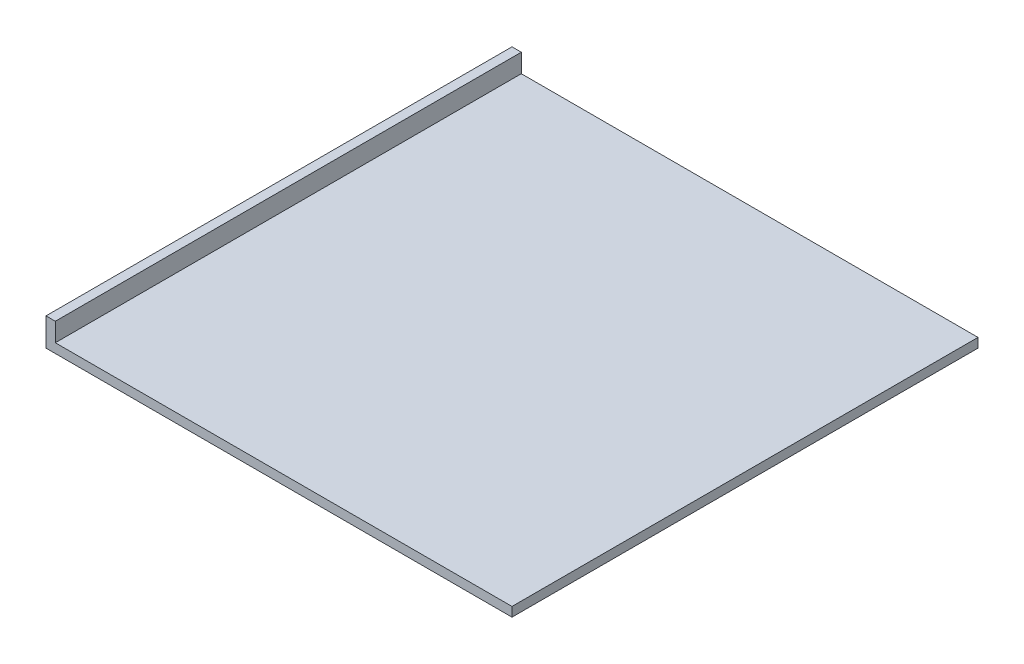
ISO-10303-21;
HEADER;
FILE_DESCRIPTION(('STEP AP214'),'2;1');
FILE_NAME('part.step','',(''),(''),'','','');
FILE_SCHEMA(('AUTOMOTIVE_DESIGN { 1 0 10303 214 1 1 1 1 }'));
ENDSEC;
DATA;
#1=APPLICATION_CONTEXT('core data for automotive mechanical design processes');
#2=APPLICATION_PROTOCOL_DEFINITION('international standard','automotive_design',2000,#1);
#3=PRODUCT_CONTEXT('',#1,'mechanical');
#4=PRODUCT('Part','Part','',(#3));
#5=PRODUCT_RELATED_PRODUCT_CATEGORY('part','',(#4));
#6=PRODUCT_DEFINITION_FORMATION('','',#4);
#7=PRODUCT_DEFINITION_CONTEXT('part definition',#1,'design');
#8=PRODUCT_DEFINITION('design','',#6,#7);
#9=PRODUCT_DEFINITION_SHAPE('','',#8);
#10=(LENGTH_UNIT() NAMED_UNIT(*) SI_UNIT(.MILLI.,.METRE.));
#11=(NAMED_UNIT(*) PLANE_ANGLE_UNIT() SI_UNIT($,.RADIAN.));
#12=(NAMED_UNIT(*) SI_UNIT($,.STERADIAN.) SOLID_ANGLE_UNIT());
#13=UNCERTAINTY_MEASURE_WITH_UNIT(LENGTH_MEASURE(1.E-05),#10,'distance_accuracy_value','');
#14=(GEOMETRIC_REPRESENTATION_CONTEXT(3) GLOBAL_UNCERTAINTY_ASSIGNED_CONTEXT((#13)) GLOBAL_UNIT_ASSIGNED_CONTEXT((#10,
#11,#12)) REPRESENTATION_CONTEXT('',''));
#15=CARTESIAN_POINT('',(0.,0.,0.));
#16=DIRECTION('',(0.,0.,1.));
#17=DIRECTION('',(1.,0.,0.));
#18=AXIS2_PLACEMENT_3D('',#15,#16,#17);
#19=CARTESIAN_POINT('',(169.151390167059,-10.,-79.704219787061));
#20=DIRECTION('',(0.,0.,-1.));
#21=DIRECTION('',(-1.,0.,0.));
#22=AXIS2_PLACEMENT_3D('',#19,#20,#21);
#23=PLANE('',#22);
#24=DIRECTION('',(0.342020143325672,-0.939692620785907,0.));
#25=VECTOR('',#24,1.);
#26=CARTESIAN_POINT('',(191.072235425957,-2.0214648158058,-79.704219787061));
#27=LINE('',#26,#25);
#28=CARTESIAN_POINT('',(190.336482403387,0.,-79.704219787061));
#29=VERTEX_POINT('',#28);
#30=CARTESIAN_POINT('',(193.976184746049,-10.,-79.704219787061));
#31=VERTEX_POINT('',#30);
#32=EDGE_CURVE('E300',#29,#31,#27,.T.);
#33=ORIENTED_EDGE('',*,*,#32,.F.);
#34=DIRECTION('',(-1.,0.,0.));
#35=VECTOR('',#34,1.);
#36=CARTESIAN_POINT('',(169.151390167059,0.,-79.704219787061));
#37=LINE('',#36,#35);
#38=CARTESIAN_POINT('',(172.791092509721,0.,-79.704219787061));
#39=VERTEX_POINT('',#38);
#40=EDGE_CURVE('E266',#29,#39,#37,.T.);
#41=ORIENTED_EDGE('',*,*,#40,.T.);
#42=DIRECTION('',(-0.342020143325672,-0.939692620785907,0.));
#43=VECTOR('',#42,1.);
#44=CARTESIAN_POINT('',(169.151390167059,-10.,-79.704219787061));
#45=LINE('',#44,#43);
#46=CARTESIAN_POINT('',(169.151390167059,-10.,-79.704219787061));
#47=VERTEX_POINT('',#46);
#48=EDGE_CURVE('E313',#39,#47,#45,.T.);
#49=ORIENTED_EDGE('',*,*,#48,.T.);
#50=DIRECTION('',(-1.,0.,0.));
#51=VECTOR('',#50,1.);
#52=CARTESIAN_POINT('',(169.151390167059,-10.,-79.704219787061));
#53=LINE('',#52,#51);
#54=EDGE_CURVE('E275',#31,#47,#53,.T.);
#55=ORIENTED_EDGE('',*,*,#54,.F.);
#56=EDGE_LOOP('',(#33,#41,#49,#55));
#57=FACE_BOUND('',#56,.T.);
#58=ADVANCED_FACE('F33',(#57),#23,.F.);
#59=CARTESIAN_POINT('',(169.151390167059,-10.,-121.239956985107));
#60=DIRECTION('',(0.,0.,1.));
#61=DIRECTION('',(1.,0.,0.));
#62=AXIS2_PLACEMENT_3D('',#59,#60,#61);
#63=PLANE('',#62);
#64=DIRECTION('',(0.342020143325672,-0.939692620785907,0.));
#65=VECTOR('',#64,1.);
#66=CARTESIAN_POINT('',(168.071343535657,61.172966280109,-121.239956985107));
#67=LINE('',#66,#65);
#68=CARTESIAN_POINT('',(190.336482403387,0.,-121.239956985107));
#69=VERTEX_POINT('',#68);
#70=CARTESIAN_POINT('',(193.976184746049,-10.,-121.239956985107));
#71=VERTEX_POINT('',#70);
#72=EDGE_CURVE('E292',#69,#71,#67,.T.);
#73=ORIENTED_EDGE('',*,*,#72,.T.);
#74=DIRECTION('',(1.,0.,0.));
#75=VECTOR('',#74,1.);
#76=CARTESIAN_POINT('',(169.151390167059,-10.,-121.239956985107));
#77=LINE('',#76,#75);
#78=CARTESIAN_POINT('',(169.151390167059,-10.,-121.239956985107));
#79=VERTEX_POINT('',#78);
#80=EDGE_CURVE('E136',#79,#71,#77,.T.);
#81=ORIENTED_EDGE('',*,*,#80,.F.);
#82=DIRECTION('',(-0.342020143325672,-0.939692620785907,0.));
#83=VECTOR('',#82,1.);
#84=CARTESIAN_POINT('',(152.578374373625,-55.533986664725,-121.239956985107));
#85=LINE('',#84,#83);
#86=CARTESIAN_POINT('',(172.791092509721,0.,-121.239956985107));
#87=VERTEX_POINT('',#86);
#88=EDGE_CURVE('E293',#87,#79,#85,.T.);
#89=ORIENTED_EDGE('',*,*,#88,.F.);
#90=DIRECTION('',(1.,0.,0.));
#91=VECTOR('',#90,1.);
#92=CARTESIAN_POINT('',(169.151390167059,0.,-121.239956985107));
#93=LINE('',#92,#91);
#94=EDGE_CURVE('E276',#87,#69,#93,.T.);
#95=ORIENTED_EDGE('',*,*,#94,.T.);
#96=EDGE_LOOP('',(#73,#81,#89,#95));
#97=FACE_BOUND('',#96,.T.);
#98=ADVANCED_FACE('F289',(#97),#63,.F.);
#99=CARTESIAN_POINT('',(0.,0.,0.));
#100=DIRECTION('',(0.,1.,0.));
#101=DIRECTION('',(0.,0.,1.));
#102=AXIS2_PLACEMENT_3D('',#99,#100,#101);
#103=PLANE('',#102);
#104=DIRECTION('',(-1.,0.,0.));
#105=VECTOR('',#104,1.);
#106=CARTESIAN_POINT('',(186.437058241461,0.,-126.612630912949));
#107=LINE('',#106,#105);
#108=CARTESIAN_POINT('',(199.752041443552,0.,-126.612630912949));
#109=VERTEX_POINT('',#108);
#110=CARTESIAN_POINT('',(188.200328048546,0.,-126.612630912949));
#111=VERTEX_POINT('',#110);
#112=EDGE_CURVE('E229',#109,#111,#107,.T.);
#113=ORIENTED_EDGE('',*,*,#112,.F.);
#114=DIRECTION('',(0.,0.,-1.));
#115=VECTOR('',#114,1.);
#116=CARTESIAN_POINT('',(199.752041443552,0.,-125.283251839237));
#117=LINE('',#116,#115);
#118=CARTESIAN_POINT('',(199.752041443552,0.,-147.283251839237));
#119=VERTEX_POINT('',#118);
#120=EDGE_CURVE('E223',#109,#119,#117,.T.);
#121=ORIENTED_EDGE('',*,*,#120,.T.);
#122=DIRECTION('',(1.,0.,0.));
#123=VECTOR('',#122,1.);
#124=CARTESIAN_POINT('',(186.437058241461,0.,-147.283251839237));
#125=LINE('',#124,#123);
#126=CARTESIAN_POINT('',(188.200328048546,0.,-147.283251839237));
#127=VERTEX_POINT('',#126);
#128=EDGE_CURVE('E228',#127,#119,#125,.T.);
#129=ORIENTED_EDGE('',*,*,#128,.F.);
#130=DIRECTION('',(0.,0.,-1.));
#131=VECTOR('',#130,1.);
#132=CARTESIAN_POINT('',(188.200328048546,0.,-125.283251839237));
#133=LINE('',#132,#131);
#134=EDGE_CURVE('E306',#111,#127,#133,.T.);
#135=ORIENTED_EDGE('',*,*,#134,.F.);
#136=EDGE_LOOP('',(#113,#121,#129,#135));
#137=FACE_BOUND('',#136,.T.);
#138=ORIENTED_EDGE('',*,*,#40,.F.);
#139=DIRECTION('',(0.,0.,-1.));
#140=VECTOR('',#139,1.);
#141=CARTESIAN_POINT('',(190.336482403387,0.,-71.2399569851072));
#142=LINE('',#141,#140);
#143=EDGE_CURVE('E297',#29,#69,#142,.T.);
#144=ORIENTED_EDGE('',*,*,#143,.T.);
#145=ORIENTED_EDGE('',*,*,#94,.F.);
#146=DIRECTION('',(0.,0.,-1.));
#147=VECTOR('',#146,1.);
#148=CARTESIAN_POINT('',(172.791092509721,0.,-71.2399569851072));
#149=LINE('',#148,#147);
#150=EDGE_CURVE('E296',#39,#87,#149,.T.);
#151=ORIENTED_EDGE('',*,*,#150,.F.);
#152=EDGE_LOOP('',(#138,#144,#145,#151));
#153=FACE_BOUND('',#152,.T.);
#154=DIRECTION('',(0.,0.,1.));
#155=VECTOR('',#154,1.);
#156=CARTESIAN_POINT('',(-250.,0.,250.));
#157=LINE('',#156,#155);
#158=CARTESIAN_POINT('',(-250.,0.,-250.));
#159=VERTEX_POINT('',#158);
#160=CARTESIAN_POINT('',(-250.,0.,250.));
#161=VERTEX_POINT('',#160);
#162=EDGE_CURVE('E92',#159,#161,#157,.T.);
#163=ORIENTED_EDGE('',*,*,#162,.F.);
#164=DIRECTION('',(-1.,0.,0.));
#165=VECTOR('',#164,1.);
#166=CARTESIAN_POINT('',(250.,0.,-250.));
#167=LINE('',#166,#165);
#168=CARTESIAN_POINT('',(250.,0.,-250.));
#169=VERTEX_POINT('',#168);
#170=EDGE_CURVE('E74',#169,#159,#167,.T.);
#171=ORIENTED_EDGE('',*,*,#170,.F.);
#172=DIRECTION('',(0.,0.,-1.));
#173=VECTOR('',#172,1.);
#174=CARTESIAN_POINT('',(250.,0.,250.));
#175=LINE('',#174,#173);
#176=CARTESIAN_POINT('',(250.,0.,250.));
#177=VERTEX_POINT('',#176);
#178=EDGE_CURVE('E87',#177,#169,#175,.T.);
#179=ORIENTED_EDGE('',*,*,#178,.F.);
#180=DIRECTION('',(1.,0.,0.));
#181=VECTOR('',#180,1.);
#182=CARTESIAN_POINT('',(250.,0.,250.));
#183=LINE('',#182,#181);
#184=EDGE_CURVE('E100',#161,#177,#183,.T.);
#185=ORIENTED_EDGE('',*,*,#184,.F.);
#186=EDGE_LOOP('',(#163,#171,#179,#185));
#187=FACE_BOUND('',#186,.T.);
#188=DIRECTION('',(-1.,0.,0.));
#189=VECTOR('',#188,1.);
#190=CARTESIAN_POINT('',(156.738992877564,0.,-136.947941376093));
#191=LINE('',#190,#189);
#192=CARTESIAN_POINT('',(175.790284764658,0.,-136.947941376093));
#193=VERTEX_POINT('',#192);
#194=CARTESIAN_POINT('',(162.51249556946,0.,-136.947941376093));
#195=VERTEX_POINT('',#194);
#196=EDGE_CURVE('E267',#193,#195,#191,.T.);
#197=ORIENTED_EDGE('',*,*,#196,.F.);
#198=DIRECTION('',(0.,0.,-1.));
#199=VECTOR('',#198,1.);
#200=CARTESIAN_POINT('',(175.790284764658,0.,-134.870302440345));
#201=LINE('',#200,#199);
#202=CARTESIAN_POINT('',(175.790284764658,0.,-184.870302440345));
#203=VERTEX_POINT('',#202);
#204=EDGE_CURVE('E319',#193,#203,#201,.T.);
#205=ORIENTED_EDGE('',*,*,#204,.T.);
#206=DIRECTION('',(1.,0.,0.));
#207=VECTOR('',#206,1.);
#208=CARTESIAN_POINT('',(156.738992877564,0.,-184.870302440345));
#209=LINE('',#208,#207);
#210=CARTESIAN_POINT('',(162.51249556946,0.,-184.870302440345));
#211=VERTEX_POINT('',#210);
#212=EDGE_CURVE('E257',#211,#203,#209,.T.);
#213=ORIENTED_EDGE('',*,*,#212,.F.);
#214=DIRECTION('',(0.,0.,-1.));
#215=VECTOR('',#214,1.);
#216=CARTESIAN_POINT('',(162.51249556946,0.,-134.870302440345));
#217=LINE('',#216,#215);
#218=EDGE_CURVE('E326',#195,#211,#217,.T.);
#219=ORIENTED_EDGE('',*,*,#218,.F.);
#220=EDGE_LOOP('',(#197,#205,#213,#219));
#221=FACE_BOUND('',#220,.T.);
#222=ADVANCED_FACE('F98',(#137,#153,#187,#221),#103,.F.);
#223=CARTESIAN_POINT('',(-250.,10.,250.));
#224=DIRECTION('',(1.,0.,0.));
#225=DIRECTION('',(0.,0.,-1.));
#226=AXIS2_PLACEMENT_3D('',#223,#224,#225);
#227=PLANE('',#226);
#228=ORIENTED_EDGE('',*,*,#162,.T.);
#229=DIRECTION('',(0.,-1.,0.));
#230=VECTOR('',#229,1.);
#231=CARTESIAN_POINT('',(-250.,10.,250.));
#232=LINE('',#231,#230);
#233=CARTESIAN_POINT('',(-250.,30.,250.));
#234=VERTEX_POINT('',#233);
#235=EDGE_CURVE('E11',#234,#161,#232,.T.);
#236=ORIENTED_EDGE('',*,*,#235,.F.);
#237=DIRECTION('',(0.,0.,1.));
#238=VECTOR('',#237,1.);
#239=CARTESIAN_POINT('',(-250.,30.,-250.));
#240=LINE('',#239,#238);
#241=CARTESIAN_POINT('',(-250.,30.,-250.));
#242=VERTEX_POINT('',#241);
#243=EDGE_CURVE('E94',#242,#234,#240,.T.);
#244=ORIENTED_EDGE('',*,*,#243,.F.);
#245=DIRECTION('',(0.,-1.,0.));
#246=VECTOR('',#245,1.);
#247=CARTESIAN_POINT('',(-250.,10.,-250.));
#248=LINE('',#247,#246);
#249=EDGE_CURVE('E79',#242,#159,#248,.T.);
#250=ORIENTED_EDGE('',*,*,#249,.T.);
#251=EDGE_LOOP('',(#228,#236,#244,#250));
#252=FACE_BOUND('',#251,.T.);
#253=ADVANCED_FACE('F35',(#252),#227,.F.);
#254=CARTESIAN_POINT('',(250.,10.,250.));
#255=DIRECTION('',(0.,0.,-1.));
#256=DIRECTION('',(-1.,0.,0.));
#257=AXIS2_PLACEMENT_3D('',#254,#255,#256);
#258=PLANE('',#257);
#259=ORIENTED_EDGE('',*,*,#184,.T.);
#260=DIRECTION('',(0.,-1.,0.));
#261=VECTOR('',#260,1.);
#262=CARTESIAN_POINT('',(250.,10.,250.));
#263=LINE('',#262,#261);
#264=CARTESIAN_POINT('',(250.,10.,250.));
#265=VERTEX_POINT('',#264);
#266=EDGE_CURVE('E41',#265,#177,#263,.T.);
#267=ORIENTED_EDGE('',*,*,#266,.F.);
#268=DIRECTION('',(1.,0.,0.));
#269=VECTOR('',#268,1.);
#270=CARTESIAN_POINT('',(250.,10.,250.));
#271=LINE('',#270,#269);
#272=CARTESIAN_POINT('',(-240.,10.,250.));
#273=VERTEX_POINT('',#272);
#274=EDGE_CURVE('E86',#273,#265,#271,.T.);
#275=ORIENTED_EDGE('',*,*,#274,.F.);
#276=DIRECTION('',(0.,-1.,0.));
#277=VECTOR('',#276,1.);
#278=CARTESIAN_POINT('',(-240.,30.,250.));
#279=LINE('',#278,#277);
#280=CARTESIAN_POINT('',(-240.,30.,250.));
#281=VERTEX_POINT('',#280);
#282=EDGE_CURVE('E101',#281,#273,#279,.T.);
#283=ORIENTED_EDGE('',*,*,#282,.F.);
#284=DIRECTION('',(1.,0.,0.));
#285=VECTOR('',#284,1.);
#286=CARTESIAN_POINT('',(-250.,30.,250.));
#287=LINE('',#286,#285);
#288=EDGE_CURVE('E121',#234,#281,#287,.T.);
#289=ORIENTED_EDGE('',*,*,#288,.F.);
#290=ORIENTED_EDGE('',*,*,#235,.T.);
#291=EDGE_LOOP('',(#259,#267,#275,#283,#289,#290));
#292=FACE_BOUND('',#291,.T.);
#293=ADVANCED_FACE('F116',(#292),#258,.F.);
#294=CARTESIAN_POINT('',(250.,10.,250.));
#295=DIRECTION('',(-1.,0.,0.));
#296=DIRECTION('',(0.,0.,1.));
#297=AXIS2_PLACEMENT_3D('',#294,#295,#296);
#298=PLANE('',#297);
#299=ORIENTED_EDGE('',*,*,#178,.T.);
#300=DIRECTION('',(0.,-1.,0.));
#301=VECTOR('',#300,1.);
#302=CARTESIAN_POINT('',(250.,10.,-250.));
#303=LINE('',#302,#301);
#304=CARTESIAN_POINT('',(250.,10.,-250.));
#305=VERTEX_POINT('',#304);
#306=EDGE_CURVE('E82',#305,#169,#303,.T.);
#307=ORIENTED_EDGE('',*,*,#306,.F.);
#308=DIRECTION('',(0.,0.,-1.));
#309=VECTOR('',#308,1.);
#310=CARTESIAN_POINT('',(250.,10.,250.));
#311=LINE('',#310,#309);
#312=EDGE_CURVE('E54',#265,#305,#311,.T.);
#313=ORIENTED_EDGE('',*,*,#312,.F.);
#314=ORIENTED_EDGE('',*,*,#266,.T.);
#315=EDGE_LOOP('',(#299,#307,#313,#314));
#316=FACE_BOUND('',#315,.T.);
#317=ADVANCED_FACE('F114',(#316),#298,.F.);
#318=CARTESIAN_POINT('',(250.,10.,-250.));
#319=DIRECTION('',(0.,0.,1.));
#320=DIRECTION('',(1.,0.,0.));
#321=AXIS2_PLACEMENT_3D('',#318,#319,#320);
#322=PLANE('',#321);
#323=ORIENTED_EDGE('',*,*,#170,.T.);
#324=ORIENTED_EDGE('',*,*,#249,.F.);
#325=DIRECTION('',(-1.,0.,0.));
#326=VECTOR('',#325,1.);
#327=CARTESIAN_POINT('',(-240.,30.,-250.));
#328=LINE('',#327,#326);
#329=CARTESIAN_POINT('',(-240.,30.,-250.));
#330=VERTEX_POINT('',#329);
#331=EDGE_CURVE('E127',#330,#242,#328,.T.);
#332=ORIENTED_EDGE('',*,*,#331,.F.);
#333=DIRECTION('',(0.,-1.,0.));
#334=VECTOR('',#333,1.);
#335=CARTESIAN_POINT('',(-240.,30.,-250.));
#336=LINE('',#335,#334);
#337=CARTESIAN_POINT('',(-240.,10.,-250.));
#338=VERTEX_POINT('',#337);
#339=EDGE_CURVE('E105',#330,#338,#336,.T.);
#340=ORIENTED_EDGE('',*,*,#339,.T.);
#341=DIRECTION('',(-1.,0.,0.));
#342=VECTOR('',#341,1.);
#343=CARTESIAN_POINT('',(250.,10.,-250.));
#344=LINE('',#343,#342);
#345=EDGE_CURVE('E96',#305,#338,#344,.T.);
#346=ORIENTED_EDGE('',*,*,#345,.F.);
#347=ORIENTED_EDGE('',*,*,#306,.T.);
#348=EDGE_LOOP('',(#323,#324,#332,#340,#346,#347));
#349=FACE_BOUND('',#348,.T.);
#350=ADVANCED_FACE('F76',(#349),#322,.F.);
#351=CARTESIAN_POINT('',(0.,10.,0.));
#352=DIRECTION('',(0.,1.,0.));
#353=DIRECTION('',(0.,0.,1.));
#354=AXIS2_PLACEMENT_3D('',#351,#352,#353);
#355=PLANE('',#354);
#356=DIRECTION('',(0.,0.,-1.));
#357=VECTOR('',#356,1.);
#358=CARTESIAN_POINT('',(-240.,10.,250.));
#359=LINE('',#358,#357);
#360=EDGE_CURVE('E48',#273,#338,#359,.T.);
#361=ORIENTED_EDGE('',*,*,#360,.F.);
#362=ORIENTED_EDGE('',*,*,#274,.T.);
#363=ORIENTED_EDGE('',*,*,#312,.T.);
#364=ORIENTED_EDGE('',*,*,#345,.T.);
#365=EDGE_LOOP('',(#361,#362,#363,#364));
#366=FACE_BOUND('',#365,.T.);
#367=ADVANCED_FACE('F140',(#366),#355,.T.);
#368=CARTESIAN_POINT('',(-240.,30.,250.));
#369=DIRECTION('',(-1.,0.,0.));
#370=DIRECTION('',(0.,0.,1.));
#371=AXIS2_PLACEMENT_3D('',#368,#369,#370);
#372=PLANE('',#371);
#373=ORIENTED_EDGE('',*,*,#360,.T.);
#374=ORIENTED_EDGE('',*,*,#339,.F.);
#375=DIRECTION('',(0.,0.,-1.));
#376=VECTOR('',#375,1.);
#377=CARTESIAN_POINT('',(-240.,30.,250.));
#378=LINE('',#377,#376);
#379=EDGE_CURVE('E129',#281,#330,#378,.T.);
#380=ORIENTED_EDGE('',*,*,#379,.F.);
#381=ORIENTED_EDGE('',*,*,#282,.T.);
#382=EDGE_LOOP('',(#373,#374,#380,#381));
#383=FACE_BOUND('',#382,.T.);
#384=ADVANCED_FACE('F144',(#383),#372,.F.);
#385=CARTESIAN_POINT('',(0.,30.,0.));
#386=DIRECTION('',(0.,1.,0.));
#387=DIRECTION('',(0.,0.,1.));
#388=AXIS2_PLACEMENT_3D('',#385,#386,#387);
#389=PLANE('',#388);
#390=ORIENTED_EDGE('',*,*,#331,.T.);
#391=ORIENTED_EDGE('',*,*,#243,.T.);
#392=ORIENTED_EDGE('',*,*,#288,.T.);
#393=ORIENTED_EDGE('',*,*,#379,.T.);
#394=EDGE_LOOP('',(#390,#391,#392,#393));
#395=FACE_BOUND('',#394,.T.);
#396=ADVANCED_FACE('F125',(#395),#389,.T.);
#397=CARTESIAN_POINT('',(0.,-10.,0.));
#398=DIRECTION('',(0.,-1.,0.));
#399=DIRECTION('',(0.,0.,-1.));
#400=AXIS2_PLACEMENT_3D('',#397,#398,#399);
#401=PLANE('',#400);
#402=DIRECTION('',(0.,0.,1.));
#403=VECTOR('',#402,1.);
#404=CARTESIAN_POINT('',(193.976184746049,-10.,-79.704219787061));
#405=LINE('',#404,#403);
#406=EDGE_CURVE('E272',#71,#31,#405,.T.);
#407=ORIENTED_EDGE('',*,*,#406,.T.);
#408=ORIENTED_EDGE('',*,*,#54,.T.);
#409=DIRECTION('',(0.,0.,-1.));
#410=VECTOR('',#409,1.);
#411=CARTESIAN_POINT('',(169.151390167059,-10.,-79.704219787061));
#412=LINE('',#411,#410);
#413=EDGE_CURVE('E279',#47,#79,#412,.T.);
#414=ORIENTED_EDGE('',*,*,#413,.T.);
#415=ORIENTED_EDGE('',*,*,#80,.T.);
#416=EDGE_LOOP('',(#407,#408,#414,#415));
#417=FACE_BOUND('',#416,.T.);
#418=ADVANCED_FACE('F367',(#417),#401,.T.);
#419=CARTESIAN_POINT('',(156.738992877564,-10.,-136.947941376093));
#420=DIRECTION('',(0.,0.,-1.));
#421=DIRECTION('',(-1.,0.,0.));
#422=AXIS2_PLACEMENT_3D('',#419,#420,#421);
#423=PLANE('',#422);
#424=DIRECTION('',(-1.,0.,0.));
#425=VECTOR('',#424,1.);
#426=CARTESIAN_POINT('',(156.738992877564,-10.,-136.947941376093));
#427=LINE('',#426,#425);
#428=CARTESIAN_POINT('',(181.563787456554,-10.,-136.947941376093));
#429=VERTEX_POINT('',#428);
#430=CARTESIAN_POINT('',(156.738992877564,-10.,-136.947941376093));
#431=VERTEX_POINT('',#430);
#432=EDGE_CURVE('E256',#429,#431,#427,.T.);
#433=ORIENTED_EDGE('',*,*,#432,.F.);
#434=DIRECTION('',(-0.500000000000005,0.866025403784436,0.));
#435=VECTOR('',#434,1.);
#436=CARTESIAN_POINT('',(175.357588811806,0.749451374567804,-136.947941376093));
#437=LINE('',#436,#435);
#438=EDGE_CURVE('E321',#429,#193,#437,.T.);
#439=ORIENTED_EDGE('',*,*,#438,.T.);
#440=ORIENTED_EDGE('',*,*,#196,.T.);
#441=DIRECTION('',(-0.500000000000005,-0.866025403784436,0.));
#442=VECTOR('',#441,1.);
#443=CARTESIAN_POINT('',(156.738992877564,-10.,-136.947941376093));
#444=LINE('',#443,#442);
#445=EDGE_CURVE('E249',#195,#431,#444,.T.);
#446=ORIENTED_EDGE('',*,*,#445,.T.);
#447=EDGE_LOOP('',(#433,#439,#440,#446));
#448=FACE_BOUND('',#447,.T.);
#449=ADVANCED_FACE('F406',(#448),#423,.F.);
#450=CARTESIAN_POINT('',(156.738992877564,-10.,-184.870302440345));
#451=DIRECTION('',(0.,0.,1.));
#452=DIRECTION('',(1.,0.,0.));
#453=AXIS2_PLACEMENT_3D('',#450,#451,#452);
#454=PLANE('',#453);
#455=ORIENTED_EDGE('',*,*,#212,.T.);
#456=DIRECTION('',(-0.500000000000005,0.866025403784436,0.));
#457=VECTOR('',#456,1.);
#458=CARTESIAN_POINT('',(181.563787456554,-10.,-184.870302440345));
#459=LINE('',#458,#457);
#460=CARTESIAN_POINT('',(181.563787456554,-10.,-184.870302440345));
#461=VERTEX_POINT('',#460);
#462=EDGE_CURVE('E316',#461,#203,#459,.T.);
#463=ORIENTED_EDGE('',*,*,#462,.F.);
#464=DIRECTION('',(1.,0.,0.));
#465=VECTOR('',#464,1.);
#466=CARTESIAN_POINT('',(156.738992877564,-10.,-184.870302440345));
#467=LINE('',#466,#465);
#468=CARTESIAN_POINT('',(156.738992877564,-10.,-184.870302440345));
#469=VERTEX_POINT('',#468);
#470=EDGE_CURVE('E263',#469,#461,#467,.T.);
#471=ORIENTED_EDGE('',*,*,#470,.F.);
#472=DIRECTION('',(-0.500000000000005,-0.866025403784436,0.));
#473=VECTOR('',#472,1.);
#474=CARTESIAN_POINT('',(156.738992877564,-10.,-184.870302440345));
#475=LINE('',#474,#473);
#476=EDGE_CURVE('E324',#211,#469,#475,.T.);
#477=ORIENTED_EDGE('',*,*,#476,.F.);
#478=EDGE_LOOP('',(#455,#463,#471,#477));
#479=FACE_BOUND('',#478,.T.);
#480=ADVANCED_FACE('F352',(#479),#454,.F.);
#481=CARTESIAN_POINT('',(0.,-10.,0.));
#482=DIRECTION('',(0.,-1.,0.));
#483=DIRECTION('',(0.,0.,-1.));
#484=AXIS2_PLACEMENT_3D('',#481,#482,#483);
#485=PLANE('',#484);
#486=DIRECTION('',(0.,0.,1.));
#487=VECTOR('',#486,1.);
#488=CARTESIAN_POINT('',(181.563787456554,-10.,-136.947941376093));
#489=LINE('',#488,#487);
#490=EDGE_CURVE('E253',#461,#429,#489,.T.);
#491=ORIENTED_EDGE('',*,*,#490,.T.);
#492=ORIENTED_EDGE('',*,*,#432,.T.);
#493=DIRECTION('',(0.,0.,-1.));
#494=VECTOR('',#493,1.);
#495=CARTESIAN_POINT('',(156.738992877564,-10.,-136.947941376093));
#496=LINE('',#495,#494);
#497=EDGE_CURVE('E260',#431,#469,#496,.T.);
#498=ORIENTED_EDGE('',*,*,#497,.T.);
#499=ORIENTED_EDGE('',*,*,#470,.T.);
#500=EDGE_LOOP('',(#491,#492,#498,#499));
#501=FACE_BOUND('',#500,.T.);
#502=ADVANCED_FACE('F345',(#501),#485,.T.);
#503=CARTESIAN_POINT('',(186.437058241461,-10.,-126.612630912949));
#504=DIRECTION('',(0.,0.,-1.));
#505=DIRECTION('',(-1.,0.,0.));
#506=AXIS2_PLACEMENT_3D('',#503,#504,#505);
#507=PLANE('',#506);
#508=DIRECTION('',(-1.,0.,0.));
#509=VECTOR('',#508,1.);
#510=CARTESIAN_POINT('',(186.437058241461,-10.,-126.612630912949));
#511=LINE('',#510,#509);
#512=CARTESIAN_POINT('',(201.515311250637,-10.,-126.612630912949));
#513=VERTEX_POINT('',#512);
#514=CARTESIAN_POINT('',(186.437058241461,-10.,-126.612630912949));
#515=VERTEX_POINT('',#514);
#516=EDGE_CURVE('E247',#513,#515,#511,.T.);
#517=ORIENTED_EDGE('',*,*,#516,.F.);
#518=DIRECTION('',(-0.173648177666934,0.984807753012207,0.));
#519=VECTOR('',#518,1.);
#520=CARTESIAN_POINT('',(201.060646289582,-7.42146687235043,-126.612630912949));
#521=LINE('',#520,#519);
#522=EDGE_CURVE('E232',#513,#109,#521,.T.);
#523=ORIENTED_EDGE('',*,*,#522,.T.);
#524=ORIENTED_EDGE('',*,*,#112,.T.);
#525=DIRECTION('',(-0.173648177666934,-0.984807753012207,0.));
#526=VECTOR('',#525,1.);
#527=CARTESIAN_POINT('',(186.437058241461,-10.,-126.612630912949));
#528=LINE('',#527,#526);
#529=EDGE_CURVE('E303',#111,#515,#528,.T.);
#530=ORIENTED_EDGE('',*,*,#529,.T.);
#531=EDGE_LOOP('',(#517,#523,#524,#530));
#532=FACE_BOUND('',#531,.T.);
#533=ADVANCED_FACE('F341',(#532),#507,.F.);
#534=CARTESIAN_POINT('',(186.437058241461,-10.,-147.283251839237));
#535=DIRECTION('',(0.,0.,1.));
#536=DIRECTION('',(1.,0.,0.));
#537=AXIS2_PLACEMENT_3D('',#534,#535,#536);
#538=PLANE('',#537);
#539=ORIENTED_EDGE('',*,*,#128,.T.);
#540=DIRECTION('',(-0.173648177666934,0.984807753012207,0.));
#541=VECTOR('',#540,1.);
#542=CARTESIAN_POINT('',(201.515311250637,-10.,-147.283251839237));
#543=LINE('',#542,#541);
#544=CARTESIAN_POINT('',(201.515311250637,-10.,-147.283251839237));
#545=VERTEX_POINT('',#544);
#546=EDGE_CURVE('E233',#545,#119,#543,.T.);
#547=ORIENTED_EDGE('',*,*,#546,.F.);
#548=DIRECTION('',(1.,0.,0.));
#549=VECTOR('',#548,1.);
#550=CARTESIAN_POINT('',(186.437058241461,-10.,-147.283251839237));
#551=LINE('',#550,#549);
#552=CARTESIAN_POINT('',(186.437058241461,-10.,-147.283251839237));
#553=VERTEX_POINT('',#552);
#554=EDGE_CURVE('E269',#553,#545,#551,.T.);
#555=ORIENTED_EDGE('',*,*,#554,.F.);
#556=DIRECTION('',(-0.173648177666934,-0.984807753012207,0.));
#557=VECTOR('',#556,1.);
#558=CARTESIAN_POINT('',(186.437058241461,-10.,-147.283251839237));
#559=LINE('',#558,#557);
#560=EDGE_CURVE('E245',#127,#553,#559,.T.);
#561=ORIENTED_EDGE('',*,*,#560,.F.);
#562=EDGE_LOOP('',(#539,#547,#555,#561));
#563=FACE_BOUND('',#562,.T.);
#564=ADVANCED_FACE('F244',(#563),#538,.F.);
#565=CARTESIAN_POINT('',(0.,-10.,0.));
#566=DIRECTION('',(0.,-1.,0.));
#567=DIRECTION('',(0.,0.,-1.));
#568=AXIS2_PLACEMENT_3D('',#565,#566,#567);
#569=PLANE('',#568);
#570=DIRECTION('',(0.,0.,1.));
#571=VECTOR('',#570,1.);
#572=CARTESIAN_POINT('',(201.515311250637,-10.,-126.612630912949));
#573=LINE('',#572,#571);
#574=EDGE_CURVE('E238',#545,#513,#573,.T.);
#575=ORIENTED_EDGE('',*,*,#574,.T.);
#576=ORIENTED_EDGE('',*,*,#516,.T.);
#577=DIRECTION('',(0.,0.,-1.));
#578=VECTOR('',#577,1.);
#579=CARTESIAN_POINT('',(186.437058241461,-10.,-126.612630912949));
#580=LINE('',#579,#578);
#581=EDGE_CURVE('E332',#515,#553,#580,.T.);
#582=ORIENTED_EDGE('',*,*,#581,.T.);
#583=ORIENTED_EDGE('',*,*,#554,.T.);
#584=EDGE_LOOP('',(#575,#576,#582,#583));
#585=FACE_BOUND('',#584,.T.);
#586=ADVANCED_FACE('F335',(#585),#569,.T.);
#587=CARTESIAN_POINT('',(156.738992877564,-10.,-134.870302440345));
#588=DIRECTION('',(0.866025403784436,-0.500000000000005,0.));
#589=DIRECTION('',(0.500000000000005,0.866025403784436,0.));
#590=AXIS2_PLACEMENT_3D('',#587,#588,#589);
#591=PLANE('',#590);
#592=ORIENTED_EDGE('',*,*,#218,.T.);
#593=ORIENTED_EDGE('',*,*,#476,.T.);
#594=ORIENTED_EDGE('',*,*,#497,.F.);
#595=ORIENTED_EDGE('',*,*,#445,.F.);
#596=EDGE_LOOP('',(#592,#593,#594,#595));
#597=FACE_BOUND('',#596,.T.);
#598=ADVANCED_FACE('F476',(#597),#591,.F.);
#599=CARTESIAN_POINT('',(181.563787456554,-10.,-134.870302440345));
#600=DIRECTION('',(-0.866025403784436,-0.500000000000005,0.));
#601=DIRECTION('',(0.500000000000005,-0.866025403784436,0.));
#602=AXIS2_PLACEMENT_3D('',#599,#600,#601);
#603=PLANE('',#602);
#604=ORIENTED_EDGE('',*,*,#490,.F.);
#605=ORIENTED_EDGE('',*,*,#462,.T.);
#606=ORIENTED_EDGE('',*,*,#204,.F.);
#607=ORIENTED_EDGE('',*,*,#438,.F.);
#608=EDGE_LOOP('',(#604,#605,#606,#607));
#609=FACE_BOUND('',#608,.T.);
#610=ADVANCED_FACE('F418',(#609),#603,.F.);
#611=CARTESIAN_POINT('',(152.578374373625,-55.533986664725,-71.2399569851072));
#612=DIRECTION('',(0.939692620785907,-0.342020143325672,0.));
#613=DIRECTION('',(0.342020143325672,0.939692620785907,0.));
#614=AXIS2_PLACEMENT_3D('',#611,#612,#613);
#615=PLANE('',#614);
#616=ORIENTED_EDGE('',*,*,#150,.T.);
#617=ORIENTED_EDGE('',*,*,#88,.T.);
#618=ORIENTED_EDGE('',*,*,#413,.F.);
#619=ORIENTED_EDGE('',*,*,#48,.F.);
#620=EDGE_LOOP('',(#616,#617,#618,#619));
#621=FACE_BOUND('',#620,.T.);
#622=ADVANCED_FACE('F414',(#621),#615,.F.);
#623=CARTESIAN_POINT('',(168.071343535657,61.172966280109,-71.2399569851072));
#624=DIRECTION('',(0.939692620785907,0.342020143325672,0.));
#625=DIRECTION('',(-0.342020143325672,0.939692620785907,0.));
#626=AXIS2_PLACEMENT_3D('',#623,#624,#625);
#627=PLANE('',#626);
#628=ORIENTED_EDGE('',*,*,#32,.T.);
#629=ORIENTED_EDGE('',*,*,#406,.F.);
#630=ORIENTED_EDGE('',*,*,#72,.F.);
#631=ORIENTED_EDGE('',*,*,#143,.F.);
#632=EDGE_LOOP('',(#628,#629,#630,#631));
#633=FACE_BOUND('',#632,.T.);
#634=ADVANCED_FACE('F302',(#633),#627,.T.);
#635=CARTESIAN_POINT('',(186.437058241461,-10.,-125.283251839237));
#636=DIRECTION('',(0.984807753012207,-0.173648177666934,0.));
#637=DIRECTION('',(0.173648177666934,0.984807753012207,0.));
#638=AXIS2_PLACEMENT_3D('',#635,#636,#637);
#639=PLANE('',#638);
#640=ORIENTED_EDGE('',*,*,#134,.T.);
#641=ORIENTED_EDGE('',*,*,#560,.T.);
#642=ORIENTED_EDGE('',*,*,#581,.F.);
#643=ORIENTED_EDGE('',*,*,#529,.F.);
#644=EDGE_LOOP('',(#640,#641,#642,#643));
#645=FACE_BOUND('',#644,.T.);
#646=ADVANCED_FACE('F339',(#645),#639,.F.);
#647=CARTESIAN_POINT('',(201.515311250637,-10.,-125.283251839237));
#648=DIRECTION('',(-0.984807753012207,-0.173648177666934,0.));
#649=DIRECTION('',(0.173648177666934,-0.984807753012207,0.));
#650=AXIS2_PLACEMENT_3D('',#647,#648,#649);
#651=PLANE('',#650);
#652=ORIENTED_EDGE('',*,*,#574,.F.);
#653=ORIENTED_EDGE('',*,*,#546,.T.);
#654=ORIENTED_EDGE('',*,*,#120,.F.);
#655=ORIENTED_EDGE('',*,*,#522,.F.);
#656=EDGE_LOOP('',(#652,#653,#654,#655));
#657=FACE_BOUND('',#656,.T.);
#658=ADVANCED_FACE('F236',(#657),#651,.F.);
#659=CLOSED_SHELL('',(#58,#98,#222,#253,#293,#317,#350,#367,#384,#396,#418,#449,#480,#502,#533,
#564,#586,#598,#610,#622,#634,#646,#658));
#660=MANIFOLD_SOLID_BREP('B2',#659);
#661=ADVANCED_BREP_SHAPE_REPRESENTATION('',(#18,#660),#14);
#662=SHAPE_DEFINITION_REPRESENTATION(#9,#661);
ENDSEC;
END-ISO-10303-21;
